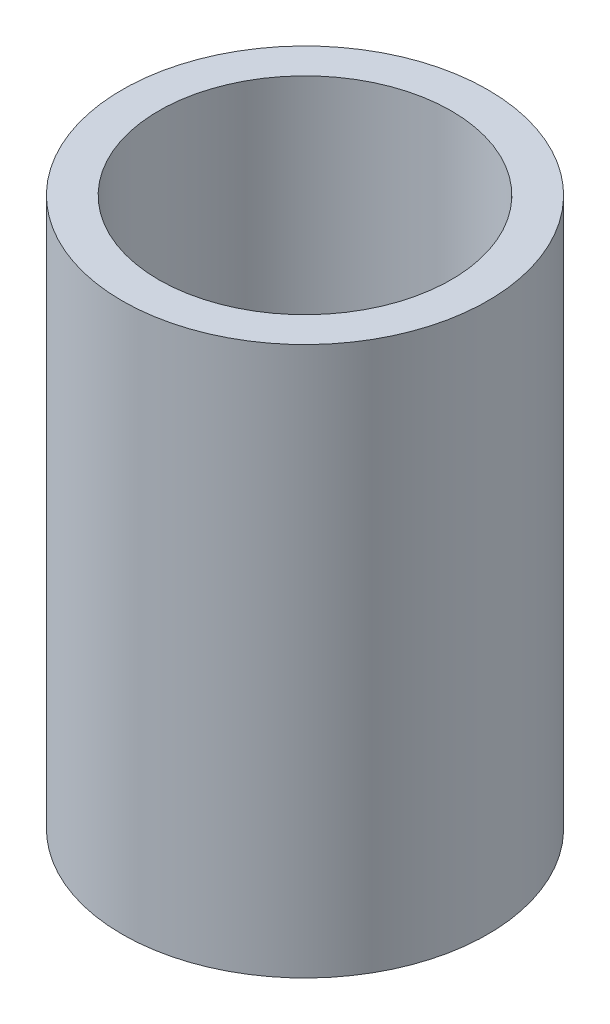
ISO-10303-21;
HEADER;
FILE_DESCRIPTION(('STEP AP214'),'2;1');
FILE_NAME('part.step','',(''),(''),'','','');
FILE_SCHEMA(('AUTOMOTIVE_DESIGN { 1 0 10303 214 1 1 1 1 }'));
ENDSEC;
DATA;
#1=APPLICATION_CONTEXT('core data for automotive mechanical design processes');
#2=APPLICATION_PROTOCOL_DEFINITION('international standard','automotive_design',2000,#1);
#3=PRODUCT_CONTEXT('',#1,'mechanical');
#4=PRODUCT('Part','Part','',(#3));
#5=PRODUCT_RELATED_PRODUCT_CATEGORY('part','',(#4));
#6=PRODUCT_DEFINITION_FORMATION('','',#4);
#7=PRODUCT_DEFINITION_CONTEXT('part definition',#1,'design');
#8=PRODUCT_DEFINITION('design','',#6,#7);
#9=PRODUCT_DEFINITION_SHAPE('','',#8);
#10=(LENGTH_UNIT() NAMED_UNIT(*) SI_UNIT(.MILLI.,.METRE.));
#11=(NAMED_UNIT(*) PLANE_ANGLE_UNIT() SI_UNIT($,.RADIAN.));
#12=(NAMED_UNIT(*) SI_UNIT($,.STERADIAN.) SOLID_ANGLE_UNIT());
#13=UNCERTAINTY_MEASURE_WITH_UNIT(LENGTH_MEASURE(1.E-05),#10,'distance_accuracy_value','');
#14=(GEOMETRIC_REPRESENTATION_CONTEXT(3) GLOBAL_UNCERTAINTY_ASSIGNED_CONTEXT((#13)) GLOBAL_UNIT_ASSIGNED_CONTEXT((#10,
#11,#12)) REPRESENTATION_CONTEXT('',''));
#15=CARTESIAN_POINT('',(0.,0.,0.));
#16=DIRECTION('',(0.,0.,1.));
#17=DIRECTION('',(1.,0.,0.));
#18=AXIS2_PLACEMENT_3D('',#15,#16,#17);
#19=CARTESIAN_POINT('',(0.,15.,0.));
#20=DIRECTION('',(0.,-1.,0.));
#21=DIRECTION('',(0.,0.,-1.));
#22=AXIS2_PLACEMENT_3D('',#19,#20,#21);
#23=CYLINDRICAL_SURFACE('',#22,5.);
#24=CARTESIAN_POINT('',(0.,15.,0.));
#25=DIRECTION('',(0.,1.,0.));
#26=DIRECTION('',(0.,0.,1.));
#27=AXIS2_PLACEMENT_3D('',#24,#25,#26);
#28=CIRCLE('',#27,5.);
#29=CARTESIAN_POINT('',(0.,15.,5.));
#30=VERTEX_POINT('',#29);
#31=EDGE_CURVE('E11',#30,#30,#28,.T.);
#32=ORIENTED_EDGE('',*,*,#31,.F.);
#33=EDGE_LOOP('',(#32));
#34=FACE_BOUND('',#33,.T.);
#35=CARTESIAN_POINT('',(0.,0.,0.));
#36=DIRECTION('',(0.,1.,0.));
#37=DIRECTION('',(0.,0.,1.));
#38=AXIS2_PLACEMENT_3D('',#35,#36,#37);
#39=CIRCLE('',#38,5.);
#40=CARTESIAN_POINT('',(0.,0.,5.));
#41=VERTEX_POINT('',#40);
#42=EDGE_CURVE('E42',#41,#41,#39,.T.);
#43=ORIENTED_EDGE('',*,*,#42,.T.);
#44=EDGE_LOOP('',(#43));
#45=FACE_BOUND('',#44,.T.);
#46=ADVANCED_FACE('F39',(#34,#45),#23,.T.);
#47=CARTESIAN_POINT('',(0.,15.,0.));
#48=DIRECTION('',(0.,1.,0.));
#49=DIRECTION('',(0.,0.,1.));
#50=AXIS2_PLACEMENT_3D('',#47,#48,#49);
#51=PLANE('',#50);
#52=CARTESIAN_POINT('',(0.,15.,0.));
#53=DIRECTION('',(0.,1.,0.));
#54=DIRECTION('',(0.,0.,1.));
#55=AXIS2_PLACEMENT_3D('',#52,#53,#54);
#56=CIRCLE('',#55,4.);
#57=CARTESIAN_POINT('',(0.,15.,4.));
#58=VERTEX_POINT('',#57);
#59=EDGE_CURVE('E56',#58,#58,#56,.T.);
#60=ORIENTED_EDGE('',*,*,#59,.F.);
#61=EDGE_LOOP('',(#60));
#62=FACE_BOUND('',#61,.T.);
#63=ORIENTED_EDGE('',*,*,#31,.T.);
#64=EDGE_LOOP('',(#63));
#65=FACE_BOUND('',#64,.T.);
#66=ADVANCED_FACE('F63',(#62,#65),#51,.T.);
#67=CARTESIAN_POINT('',(0.,0.,0.));
#68=DIRECTION('',(0.,1.,0.));
#69=DIRECTION('',(0.,0.,1.));
#70=AXIS2_PLACEMENT_3D('',#67,#68,#69);
#71=PLANE('',#70);
#72=ORIENTED_EDGE('',*,*,#42,.F.);
#73=EDGE_LOOP('',(#72));
#74=FACE_BOUND('',#73,.T.);
#75=ADVANCED_FACE('F65',(#74),#71,.F.);
#76=CARTESIAN_POINT('',(0.,-11.3137084989848,0.));
#77=DIRECTION('',(0.,1.,0.));
#78=DIRECTION('',(0.,0.,1.));
#79=AXIS2_PLACEMENT_3D('',#76,#77,#78);
#80=CYLINDRICAL_SURFACE('',#79,4.);
#81=CARTESIAN_POINT('',(0.,2.,0.));
#82=DIRECTION('',(0.,1.,0.));
#83=DIRECTION('',(0.,0.,1.));
#84=AXIS2_PLACEMENT_3D('',#81,#82,#83);
#85=CIRCLE('',#84,4.);
#86=CARTESIAN_POINT('',(0.,2.,4.));
#87=VERTEX_POINT('',#86);
#88=EDGE_CURVE('E51',#87,#87,#85,.F.);
#89=ORIENTED_EDGE('',*,*,#88,.T.);
#90=EDGE_LOOP('',(#89));
#91=FACE_BOUND('',#90,.T.);
#92=ORIENTED_EDGE('',*,*,#59,.T.);
#93=EDGE_LOOP('',(#92));
#94=FACE_BOUND('',#93,.T.);
#95=ADVANCED_FACE('F61',(#91,#94),#80,.F.);
#96=CARTESIAN_POINT('',(0.,2.,0.));
#97=DIRECTION('',(0.,1.,0.));
#98=DIRECTION('',(0.,0.,1.));
#99=AXIS2_PLACEMENT_3D('',#96,#97,#98);
#100=PLANE('',#99);
#101=ORIENTED_EDGE('',*,*,#88,.F.);
#102=EDGE_LOOP('',(#101));
#103=FACE_BOUND('',#102,.T.);
#104=ADVANCED_FACE('F76',(#103),#100,.T.);
#105=CLOSED_SHELL('',(#46,#66,#75,#95,#104));
#106=MANIFOLD_SOLID_BREP('B2',#105);
#107=ADVANCED_BREP_SHAPE_REPRESENTATION('',(#18,#106),#14);
#108=SHAPE_DEFINITION_REPRESENTATION(#9,#107);
ENDSEC;
END-ISO-10303-21;
